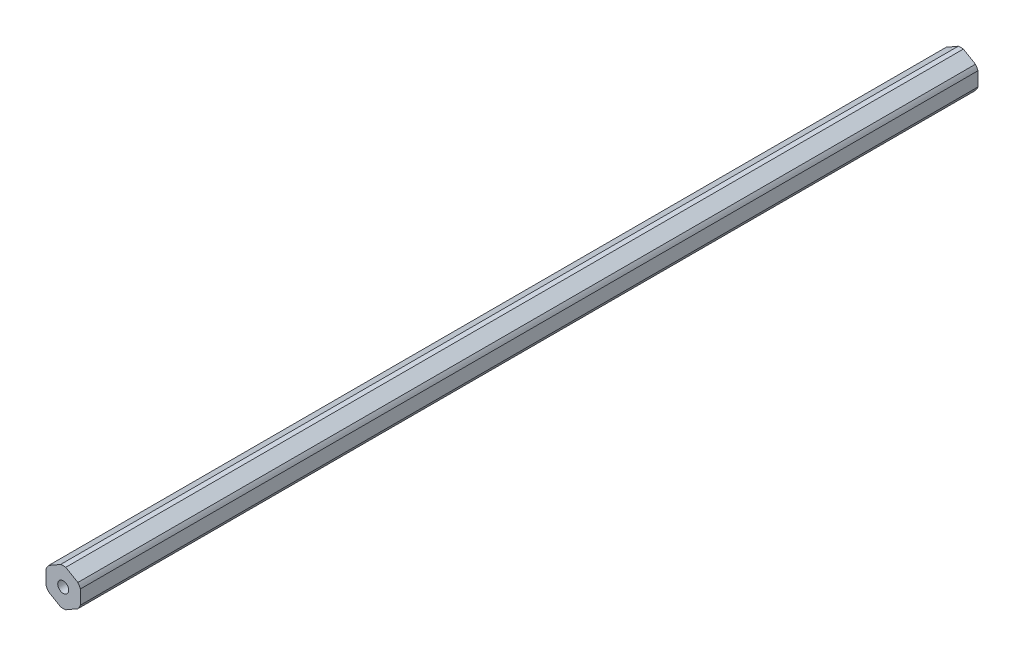
ISO-10303-21;
HEADER;
FILE_DESCRIPTION(('STEP AP214'),'2;1');
FILE_NAME('part.step','',(''),(''),'','','');
FILE_SCHEMA(('AUTOMOTIVE_DESIGN { 1 0 10303 214 1 1 1 1 }'));
ENDSEC;
DATA;
#1=APPLICATION_CONTEXT('core data for automotive mechanical design processes');
#2=APPLICATION_PROTOCOL_DEFINITION('international standard','automotive_design',2000,#1);
#3=PRODUCT_CONTEXT('',#1,'mechanical');
#4=PRODUCT('Part','Part','',(#3));
#5=PRODUCT_RELATED_PRODUCT_CATEGORY('part','',(#4));
#6=PRODUCT_DEFINITION_FORMATION('','',#4);
#7=PRODUCT_DEFINITION_CONTEXT('part definition',#1,'design');
#8=PRODUCT_DEFINITION('design','',#6,#7);
#9=PRODUCT_DEFINITION_SHAPE('','',#8);
#10=(LENGTH_UNIT() NAMED_UNIT(*) SI_UNIT(.MILLI.,.METRE.));
#11=(NAMED_UNIT(*) PLANE_ANGLE_UNIT() SI_UNIT($,.RADIAN.));
#12=(NAMED_UNIT(*) SI_UNIT($,.STERADIAN.) SOLID_ANGLE_UNIT());
#13=UNCERTAINTY_MEASURE_WITH_UNIT(LENGTH_MEASURE(1.E-05),#10,'distance_accuracy_value','');
#14=(GEOMETRIC_REPRESENTATION_CONTEXT(3) GLOBAL_UNCERTAINTY_ASSIGNED_CONTEXT((#13)) GLOBAL_UNIT_ASSIGNED_CONTEXT((#10,
#11,#12)) REPRESENTATION_CONTEXT('',''));
#15=CARTESIAN_POINT('',(0.,0.,0.));
#16=DIRECTION('',(0.,0.,1.));
#17=DIRECTION('',(1.,0.,0.));
#18=AXIS2_PLACEMENT_3D('',#15,#16,#17);
#19=CARTESIAN_POINT('',(6.35,0.,165.66388));
#20=DIRECTION('',(-1.,0.,0.));
#21=DIRECTION('',(0.,-1.,0.));
#22=AXIS2_PLACEMENT_3D('',#19,#20,#21);
#23=PLANE('',#22);
#24=DIRECTION('',(0.,1.,0.));
#25=VECTOR('',#24,1.);
#26=CARTESIAN_POINT('',(6.35,0.,-165.66388));
#27=LINE('',#26,#25);
#28=CARTESIAN_POINT('',(6.35,-2.59030191290513,-165.66388));
#29=VERTEX_POINT('',#28);
#30=CARTESIAN_POINT('',(6.35,2.59030191290513,-165.66388));
#31=VERTEX_POINT('',#30);
#32=EDGE_CURVE('E187',#29,#31,#27,.T.);
#33=ORIENTED_EDGE('',*,*,#32,.T.);
#34=DIRECTION('',(0.,0.,-1.));
#35=VECTOR('',#34,1.);
#36=CARTESIAN_POINT('',(6.35,2.59030191290513,165.66388));
#37=LINE('',#36,#35);
#38=CARTESIAN_POINT('',(6.35,2.59030191290513,165.66388));
#39=VERTEX_POINT('',#38);
#40=EDGE_CURVE('E11',#39,#31,#37,.T.);
#41=ORIENTED_EDGE('',*,*,#40,.F.);
#42=DIRECTION('',(0.,1.,0.));
#43=VECTOR('',#42,1.);
#44=CARTESIAN_POINT('',(6.35,0.,165.66388));
#45=LINE('',#44,#43);
#46=CARTESIAN_POINT('',(6.35,-2.59030191290513,165.66388));
#47=VERTEX_POINT('',#46);
#48=EDGE_CURVE('E267',#47,#39,#45,.T.);
#49=ORIENTED_EDGE('',*,*,#48,.F.);
#50=DIRECTION('',(0.,0.,-1.));
#51=VECTOR('',#50,1.);
#52=CARTESIAN_POINT('',(6.35,-2.59030191290513,165.66388));
#53=LINE('',#52,#51);
#54=EDGE_CURVE('E183',#47,#29,#53,.T.);
#55=ORIENTED_EDGE('',*,*,#54,.T.);
#56=EDGE_LOOP('',(#33,#41,#49,#55));
#57=FACE_BOUND('',#56,.T.);
#58=ADVANCED_FACE('F58',(#57),#23,.F.);
#59=CARTESIAN_POINT('',(0.,0.,165.66388));
#60=DIRECTION('',(0.,0.,-1.));
#61=DIRECTION('',(-1.,0.,0.));
#62=AXIS2_PLACEMENT_3D('',#59,#60,#61);
#63=CYLINDRICAL_SURFACE('',#62,6.858);
#64=CARTESIAN_POINT('',(0.,0.,-165.66388));
#65=DIRECTION('',(0.,0.,1.));
#66=DIRECTION('',(1.,0.,0.));
#67=AXIS2_PLACEMENT_3D('',#64,#65,#66);
#68=CIRCLE('',#67,6.858);
#69=CARTESIAN_POINT('',(5.41826726004727,4.20411035757862,-165.66388));
#70=VERTEX_POINT('',#69);
#71=EDGE_CURVE('E191',#31,#70,#68,.T.);
#72=ORIENTED_EDGE('',*,*,#71,.T.);
#73=DIRECTION('',(0.,0.,-1.));
#74=VECTOR('',#73,1.);
#75=CARTESIAN_POINT('',(5.41826726004727,4.20411035757862,165.66388));
#76=LINE('',#75,#74);
#77=CARTESIAN_POINT('',(5.41826726004727,4.20411035757862,165.66388));
#78=VERTEX_POINT('',#77);
#79=EDGE_CURVE('E67',#78,#70,#76,.T.);
#80=ORIENTED_EDGE('',*,*,#79,.F.);
#81=CARTESIAN_POINT('',(0.,0.,165.66388));
#82=DIRECTION('',(0.,0.,1.));
#83=DIRECTION('',(1.,0.,0.));
#84=AXIS2_PLACEMENT_3D('',#81,#82,#83);
#85=CIRCLE('',#84,6.858);
#86=EDGE_CURVE('E131',#39,#78,#85,.T.);
#87=ORIENTED_EDGE('',*,*,#86,.F.);
#88=ORIENTED_EDGE('',*,*,#40,.T.);
#89=EDGE_LOOP('',(#72,#80,#87,#88));
#90=FACE_BOUND('',#89,.T.);
#91=ADVANCED_FACE('F310',(#90),#63,.T.);
#92=CARTESIAN_POINT('',(3.175,5.49926131403119,165.66388));
#93=DIRECTION('',(-0.5,-0.866025403784438,0.));
#94=DIRECTION('',(0.866025403784439,-0.5,0.));
#95=AXIS2_PLACEMENT_3D('',#92,#93,#94);
#96=PLANE('',#95);
#97=DIRECTION('',(-0.866025403784439,0.5,0.));
#98=VECTOR('',#97,1.);
#99=CARTESIAN_POINT('',(3.175,5.49926131403119,-165.66388));
#100=LINE('',#99,#98);
#101=CARTESIAN_POINT('',(0.931732739952733,6.79441227048375,-165.66388));
#102=VERTEX_POINT('',#101);
#103=EDGE_CURVE('E195',#70,#102,#100,.T.);
#104=ORIENTED_EDGE('',*,*,#103,.T.);
#105=DIRECTION('',(0.,0.,-1.));
#106=VECTOR('',#105,1.);
#107=CARTESIAN_POINT('',(0.931732739952733,6.79441227048375,165.66388));
#108=LINE('',#107,#106);
#109=CARTESIAN_POINT('',(0.931732739952733,6.79441227048375,165.66388));
#110=VERTEX_POINT('',#109);
#111=EDGE_CURVE('E238',#110,#102,#108,.T.);
#112=ORIENTED_EDGE('',*,*,#111,.F.);
#113=DIRECTION('',(-0.866025403784439,0.5,0.));
#114=VECTOR('',#113,1.);
#115=CARTESIAN_POINT('',(3.175,5.49926131403119,165.66388));
#116=LINE('',#115,#114);
#117=EDGE_CURVE('E248',#78,#110,#116,.T.);
#118=ORIENTED_EDGE('',*,*,#117,.F.);
#119=ORIENTED_EDGE('',*,*,#79,.T.);
#120=EDGE_LOOP('',(#104,#112,#118,#119));
#121=FACE_BOUND('',#120,.T.);
#122=ADVANCED_FACE('F246',(#121),#96,.F.);
#123=CARTESIAN_POINT('',(-0.931732739952731,6.79441227048375,-165.66388));
#124=VERTEX_POINT('',#123);
#125=EDGE_CURVE('E196',#102,#124,#68,.T.);
#126=ORIENTED_EDGE('',*,*,#125,.T.);
#127=DIRECTION('',(0.,0.,-1.));
#128=VECTOR('',#127,1.);
#129=CARTESIAN_POINT('',(-0.931732739952731,6.79441227048375,165.66388));
#130=LINE('',#129,#128);
#131=CARTESIAN_POINT('',(-0.931732739952731,6.79441227048375,165.66388));
#132=VERTEX_POINT('',#131);
#133=EDGE_CURVE('E234',#132,#124,#130,.T.);
#134=ORIENTED_EDGE('',*,*,#133,.F.);
#135=EDGE_CURVE('E273',#110,#132,#85,.T.);
#136=ORIENTED_EDGE('',*,*,#135,.F.);
#137=ORIENTED_EDGE('',*,*,#111,.T.);
#138=EDGE_LOOP('',(#126,#134,#136,#137));
#139=FACE_BOUND('',#138,.T.);
#140=ADVANCED_FACE('F293',(#139),#63,.T.);
#141=CARTESIAN_POINT('',(-3.175,5.49926131403119,165.66388));
#142=DIRECTION('',(0.5,-0.866025403784438,0.));
#143=DIRECTION('',(0.866025403784439,0.5,0.));
#144=AXIS2_PLACEMENT_3D('',#141,#142,#143);
#145=PLANE('',#144);
#146=DIRECTION('',(-0.866025403784439,-0.5,0.));
#147=VECTOR('',#146,1.);
#148=CARTESIAN_POINT('',(-3.175,5.49926131403119,-165.66388));
#149=LINE('',#148,#147);
#150=CARTESIAN_POINT('',(-5.41826726004727,4.20411035757862,-165.66388));
#151=VERTEX_POINT('',#150);
#152=EDGE_CURVE('E199',#124,#151,#149,.T.);
#153=ORIENTED_EDGE('',*,*,#152,.T.);
#154=DIRECTION('',(0.,0.,-1.));
#155=VECTOR('',#154,1.);
#156=CARTESIAN_POINT('',(-5.41826726004727,4.20411035757862,165.66388));
#157=LINE('',#156,#155);
#158=CARTESIAN_POINT('',(-5.41826726004727,4.20411035757862,165.66388));
#159=VERTEX_POINT('',#158);
#160=EDGE_CURVE('E230',#159,#151,#157,.T.);
#161=ORIENTED_EDGE('',*,*,#160,.F.);
#162=DIRECTION('',(-0.866025403784439,-0.5,0.));
#163=VECTOR('',#162,1.);
#164=CARTESIAN_POINT('',(-3.175,5.49926131403119,165.66388));
#165=LINE('',#164,#163);
#166=EDGE_CURVE('E279',#132,#159,#165,.T.);
#167=ORIENTED_EDGE('',*,*,#166,.F.);
#168=ORIENTED_EDGE('',*,*,#133,.T.);
#169=EDGE_LOOP('',(#153,#161,#167,#168));
#170=FACE_BOUND('',#169,.T.);
#171=ADVANCED_FACE('F295',(#170),#145,.F.);
#172=CARTESIAN_POINT('',(-6.35,2.59030191290514,-165.66388));
#173=VERTEX_POINT('',#172);
#174=EDGE_CURVE('E202',#151,#173,#68,.T.);
#175=ORIENTED_EDGE('',*,*,#174,.T.);
#176=DIRECTION('',(0.,0.,-1.));
#177=VECTOR('',#176,1.);
#178=CARTESIAN_POINT('',(-6.35,2.59030191290514,165.66388));
#179=LINE('',#178,#177);
#180=CARTESIAN_POINT('',(-6.35,2.59030191290514,165.66388));
#181=VERTEX_POINT('',#180);
#182=EDGE_CURVE('E226',#181,#173,#179,.T.);
#183=ORIENTED_EDGE('',*,*,#182,.F.);
#184=EDGE_CURVE('E281',#159,#181,#85,.T.);
#185=ORIENTED_EDGE('',*,*,#184,.F.);
#186=ORIENTED_EDGE('',*,*,#160,.T.);
#187=EDGE_LOOP('',(#175,#183,#185,#186));
#188=FACE_BOUND('',#187,.T.);
#189=ADVANCED_FACE('F296',(#188),#63,.T.);
#190=CARTESIAN_POINT('',(-6.35,0.,165.66388));
#191=DIRECTION('',(1.,0.,0.));
#192=DIRECTION('',(0.,1.,0.));
#193=AXIS2_PLACEMENT_3D('',#190,#191,#192);
#194=PLANE('',#193);
#195=DIRECTION('',(0.,-1.,0.));
#196=VECTOR('',#195,1.);
#197=CARTESIAN_POINT('',(-6.35,0.,-165.66388));
#198=LINE('',#197,#196);
#199=CARTESIAN_POINT('',(-6.35,-2.59030191290514,-165.66388));
#200=VERTEX_POINT('',#199);
#201=EDGE_CURVE('E203',#173,#200,#198,.T.);
#202=ORIENTED_EDGE('',*,*,#201,.T.);
#203=DIRECTION('',(0.,0.,-1.));
#204=VECTOR('',#203,1.);
#205=CARTESIAN_POINT('',(-6.35,-2.59030191290514,165.66388));
#206=LINE('',#205,#204);
#207=CARTESIAN_POINT('',(-6.35,-2.59030191290514,165.66388));
#208=VERTEX_POINT('',#207);
#209=EDGE_CURVE('E222',#208,#200,#206,.T.);
#210=ORIENTED_EDGE('',*,*,#209,.F.);
#211=DIRECTION('',(0.,-1.,0.));
#212=VECTOR('',#211,1.);
#213=CARTESIAN_POINT('',(-6.35,0.,165.66388));
#214=LINE('',#213,#212);
#215=EDGE_CURVE('E282',#181,#208,#214,.T.);
#216=ORIENTED_EDGE('',*,*,#215,.F.);
#217=ORIENTED_EDGE('',*,*,#182,.T.);
#218=EDGE_LOOP('',(#202,#210,#216,#217));
#219=FACE_BOUND('',#218,.T.);
#220=ADVANCED_FACE('F299',(#219),#194,.F.);
#221=CARTESIAN_POINT('',(-5.41826726004728,-4.20411035757862,-165.66388));
#222=VERTEX_POINT('',#221);
#223=EDGE_CURVE('E206',#200,#222,#68,.T.);
#224=ORIENTED_EDGE('',*,*,#223,.T.);
#225=DIRECTION('',(0.,0.,-1.));
#226=VECTOR('',#225,1.);
#227=CARTESIAN_POINT('',(-5.41826726004728,-4.20411035757862,165.66388));
#228=LINE('',#227,#226);
#229=CARTESIAN_POINT('',(-5.41826726004728,-4.20411035757862,165.66388));
#230=VERTEX_POINT('',#229);
#231=EDGE_CURVE('E218',#230,#222,#228,.T.);
#232=ORIENTED_EDGE('',*,*,#231,.F.);
#233=EDGE_CURVE('E170',#208,#230,#85,.T.);
#234=ORIENTED_EDGE('',*,*,#233,.F.);
#235=ORIENTED_EDGE('',*,*,#209,.T.);
#236=EDGE_LOOP('',(#224,#232,#234,#235));
#237=FACE_BOUND('',#236,.T.);
#238=ADVANCED_FACE('F301',(#237),#63,.T.);
#239=CARTESIAN_POINT('',(-3.175,-5.49926131403118,165.66388));
#240=DIRECTION('',(0.5,0.866025403784439,0.));
#241=DIRECTION('',(-0.866025403784439,0.5,0.));
#242=AXIS2_PLACEMENT_3D('',#239,#240,#241);
#243=PLANE('',#242);
#244=DIRECTION('',(0.866025403784439,-0.5,0.));
#245=VECTOR('',#244,1.);
#246=CARTESIAN_POINT('',(-3.175,-5.49926131403118,-165.66388));
#247=LINE('',#246,#245);
#248=CARTESIAN_POINT('',(-0.931732739952721,-6.79441227048375,-165.66388));
#249=VERTEX_POINT('',#248);
#250=EDGE_CURVE('E207',#222,#249,#247,.T.);
#251=ORIENTED_EDGE('',*,*,#250,.T.);
#252=DIRECTION('',(0.,0.,-1.));
#253=VECTOR('',#252,1.);
#254=CARTESIAN_POINT('',(-0.931732739952721,-6.79441227048375,165.66388));
#255=LINE('',#254,#253);
#256=CARTESIAN_POINT('',(-0.931732739952721,-6.79441227048375,165.66388));
#257=VERTEX_POINT('',#256);
#258=EDGE_CURVE('E176',#257,#249,#255,.T.);
#259=ORIENTED_EDGE('',*,*,#258,.F.);
#260=DIRECTION('',(0.866025403784439,-0.5,0.));
#261=VECTOR('',#260,1.);
#262=CARTESIAN_POINT('',(-3.175,-5.49926131403118,165.66388));
#263=LINE('',#262,#261);
#264=EDGE_CURVE('E164',#230,#257,#263,.T.);
#265=ORIENTED_EDGE('',*,*,#264,.F.);
#266=ORIENTED_EDGE('',*,*,#231,.T.);
#267=EDGE_LOOP('',(#251,#259,#265,#266));
#268=FACE_BOUND('',#267,.T.);
#269=ADVANCED_FACE('F304',(#268),#243,.F.);
#270=CARTESIAN_POINT('',(0.931732739952731,-6.79441227048375,-165.66388));
#271=VERTEX_POINT('',#270);
#272=EDGE_CURVE('E174',#249,#271,#68,.T.);
#273=ORIENTED_EDGE('',*,*,#272,.T.);
#274=DIRECTION('',(0.,0.,-1.));
#275=VECTOR('',#274,1.);
#276=CARTESIAN_POINT('',(0.931732739952731,-6.79441227048375,165.66388));
#277=LINE('',#276,#275);
#278=CARTESIAN_POINT('',(0.931732739952731,-6.79441227048375,165.66388));
#279=VERTEX_POINT('',#278);
#280=EDGE_CURVE('E171',#279,#271,#277,.T.);
#281=ORIENTED_EDGE('',*,*,#280,.F.);
#282=EDGE_CURVE('E158',#257,#279,#85,.T.);
#283=ORIENTED_EDGE('',*,*,#282,.F.);
#284=ORIENTED_EDGE('',*,*,#258,.T.);
#285=EDGE_LOOP('',(#273,#281,#283,#284));
#286=FACE_BOUND('',#285,.T.);
#287=ADVANCED_FACE('F172',(#286),#63,.T.);
#288=CARTESIAN_POINT('',(3.175,-5.49926131403118,165.66388));
#289=DIRECTION('',(-0.5,0.866025403784438,0.));
#290=DIRECTION('',(-0.866025403784439,-0.5,0.));
#291=AXIS2_PLACEMENT_3D('',#288,#289,#290);
#292=PLANE('',#291);
#293=DIRECTION('',(0.866025403784439,0.5,0.));
#294=VECTOR('',#293,1.);
#295=CARTESIAN_POINT('',(3.175,-5.49926131403118,-165.66388));
#296=LINE('',#295,#294);
#297=CARTESIAN_POINT('',(5.41826726004727,-4.20411035757862,-165.66388));
#298=VERTEX_POINT('',#297);
#299=EDGE_CURVE('E117',#271,#298,#296,.T.);
#300=ORIENTED_EDGE('',*,*,#299,.T.);
#301=DIRECTION('',(0.,0.,-1.));
#302=VECTOR('',#301,1.);
#303=CARTESIAN_POINT('',(5.41826726004727,-4.20411035757862,165.66388));
#304=LINE('',#303,#302);
#305=CARTESIAN_POINT('',(5.41826726004727,-4.20411035757862,165.66388));
#306=VERTEX_POINT('',#305);
#307=EDGE_CURVE('E177',#306,#298,#304,.T.);
#308=ORIENTED_EDGE('',*,*,#307,.F.);
#309=DIRECTION('',(0.866025403784439,0.5,0.));
#310=VECTOR('',#309,1.);
#311=CARTESIAN_POINT('',(3.175,-5.49926131403118,165.66388));
#312=LINE('',#311,#310);
#313=EDGE_CURVE('E162',#279,#306,#312,.T.);
#314=ORIENTED_EDGE('',*,*,#313,.F.);
#315=ORIENTED_EDGE('',*,*,#280,.T.);
#316=EDGE_LOOP('',(#300,#308,#314,#315));
#317=FACE_BOUND('',#316,.T.);
#318=ADVANCED_FACE('F179',(#317),#292,.F.);
#319=EDGE_CURVE('E123',#298,#29,#68,.T.);
#320=ORIENTED_EDGE('',*,*,#319,.T.);
#321=ORIENTED_EDGE('',*,*,#54,.F.);
#322=EDGE_CURVE('E75',#306,#47,#85,.T.);
#323=ORIENTED_EDGE('',*,*,#322,.F.);
#324=ORIENTED_EDGE('',*,*,#307,.T.);
#325=EDGE_LOOP('',(#320,#321,#323,#324));
#326=FACE_BOUND('',#325,.T.);
#327=ADVANCED_FACE('F307',(#326),#63,.T.);
#328=CARTESIAN_POINT('',(0.,0.,165.66388));
#329=DIRECTION('',(0.,0.,1.));
#330=DIRECTION('',(1.,0.,0.));
#331=AXIS2_PLACEMENT_3D('',#328,#329,#330);
#332=PLANE('',#331);
#333=CARTESIAN_POINT('',(0.,0.,165.66388));
#334=DIRECTION('',(0.,0.,1.));
#335=DIRECTION('',(1.,0.,0.));
#336=AXIS2_PLACEMENT_3D('',#333,#334,#335);
#337=CIRCLE('',#336,2.01929999999999);
#338=CARTESIAN_POINT('',(2.01929999999999,0.,165.66388));
#339=VERTEX_POINT('',#338);
#340=EDGE_CURVE('E476',#339,#339,#337,.T.);
#341=ORIENTED_EDGE('',*,*,#340,.F.);
#342=EDGE_LOOP('',(#341));
#343=FACE_BOUND('',#342,.T.);
#344=ORIENTED_EDGE('',*,*,#48,.T.);
#345=ORIENTED_EDGE('',*,*,#86,.T.);
#346=ORIENTED_EDGE('',*,*,#117,.T.);
#347=ORIENTED_EDGE('',*,*,#135,.T.);
#348=ORIENTED_EDGE('',*,*,#166,.T.);
#349=ORIENTED_EDGE('',*,*,#184,.T.);
#350=ORIENTED_EDGE('',*,*,#215,.T.);
#351=ORIENTED_EDGE('',*,*,#233,.T.);
#352=ORIENTED_EDGE('',*,*,#264,.T.);
#353=ORIENTED_EDGE('',*,*,#282,.T.);
#354=ORIENTED_EDGE('',*,*,#313,.T.);
#355=ORIENTED_EDGE('',*,*,#322,.T.);
#356=EDGE_LOOP('',(#344,#345,#346,#347,#348,#349,#350,#351,#352,#353,#354,#355));
#357=FACE_BOUND('',#356,.T.);
#358=ADVANCED_FACE('F160',(#343,#357),#332,.T.);
#359=CARTESIAN_POINT('',(0.,0.,-165.66388));
#360=DIRECTION('',(0.,0.,1.));
#361=DIRECTION('',(1.,0.,0.));
#362=AXIS2_PLACEMENT_3D('',#359,#360,#361);
#363=PLANE('',#362);
#364=CARTESIAN_POINT('',(0.,0.,-165.66388));
#365=DIRECTION('',(0.,0.,-1.));
#366=DIRECTION('',(-1.,0.,0.));
#367=AXIS2_PLACEMENT_3D('',#364,#365,#366);
#368=CIRCLE('',#367,2.01929999999999);
#369=CARTESIAN_POINT('',(-2.01929999999999,0.,-165.66388));
#370=VERTEX_POINT('',#369);
#371=EDGE_CURVE('E480',#370,#370,#368,.T.);
#372=ORIENTED_EDGE('',*,*,#371,.F.);
#373=EDGE_LOOP('',(#372));
#374=FACE_BOUND('',#373,.T.);
#375=ORIENTED_EDGE('',*,*,#32,.F.);
#376=ORIENTED_EDGE('',*,*,#319,.F.);
#377=ORIENTED_EDGE('',*,*,#299,.F.);
#378=ORIENTED_EDGE('',*,*,#272,.F.);
#379=ORIENTED_EDGE('',*,*,#250,.F.);
#380=ORIENTED_EDGE('',*,*,#223,.F.);
#381=ORIENTED_EDGE('',*,*,#201,.F.);
#382=ORIENTED_EDGE('',*,*,#174,.F.);
#383=ORIENTED_EDGE('',*,*,#152,.F.);
#384=ORIENTED_EDGE('',*,*,#125,.F.);
#385=ORIENTED_EDGE('',*,*,#103,.F.);
#386=ORIENTED_EDGE('',*,*,#71,.F.);
#387=EDGE_LOOP('',(#375,#376,#377,#378,#379,#380,#381,#382,#383,#384,#385,#386));
#388=FACE_BOUND('',#387,.T.);
#389=ADVANCED_FACE('F252',(#374,#388),#363,.F.);
#390=CARTESIAN_POINT('',(0.,0.,-149.31644));
#391=DIRECTION('',(0.,0.,-1.));
#392=DIRECTION('',(-1.,0.,0.));
#393=AXIS2_PLACEMENT_3D('',#390,#391,#392);
#394=CONICAL_SURFACE('',#393,2.01929999999999,1.02974425867665);
#395=CARTESIAN_POINT('',(0.,0.,-148.103122151998));
#396=VERTEX_POINT('',#395);
#397=VERTEX_LOOP('',#396);
#398=FACE_BOUND('',#397,.T.);
#399=CARTESIAN_POINT('',(0.,0.,-149.31644));
#400=DIRECTION('',(0.,0.,-1.));
#401=DIRECTION('',(-1.,0.,0.));
#402=AXIS2_PLACEMENT_3D('',#399,#400,#401);
#403=CIRCLE('',#402,2.01929999999999);
#404=CARTESIAN_POINT('',(-2.01929999999999,0.,-149.31644));
#405=VERTEX_POINT('',#404);
#406=EDGE_CURVE('E192',#405,#405,#403,.T.);
#407=ORIENTED_EDGE('',*,*,#406,.T.);
#408=EDGE_LOOP('',(#407));
#409=FACE_BOUND('',#408,.T.);
#410=ADVANCED_FACE('F406',(#398,#409),#394,.F.);
#411=CARTESIAN_POINT('',(0.,0.,-165.66388));
#412=DIRECTION('',(0.,0.,-1.));
#413=DIRECTION('',(-1.,0.,0.));
#414=AXIS2_PLACEMENT_3D('',#411,#412,#413);
#415=CYLINDRICAL_SURFACE('',#414,2.01929999999999);
#416=ORIENTED_EDGE('',*,*,#406,.F.);
#417=EDGE_LOOP('',(#416));
#418=FACE_BOUND('',#417,.T.);
#419=ORIENTED_EDGE('',*,*,#371,.T.);
#420=EDGE_LOOP('',(#419));
#421=FACE_BOUND('',#420,.T.);
#422=ADVANCED_FACE('F415',(#418,#421),#415,.F.);
#423=CARTESIAN_POINT('',(0.,0.,149.31644));
#424=DIRECTION('',(0.,0.,1.));
#425=DIRECTION('',(1.,0.,0.));
#426=AXIS2_PLACEMENT_3D('',#423,#424,#425);
#427=CONICAL_SURFACE('',#426,2.01929999999999,1.02974425867665);
#428=CARTESIAN_POINT('',(0.,0.,148.103122151998));
#429=VERTEX_POINT('',#428);
#430=VERTEX_LOOP('',#429);
#431=FACE_BOUND('',#430,.T.);
#432=CARTESIAN_POINT('',(0.,0.,149.31644));
#433=DIRECTION('',(0.,0.,1.));
#434=DIRECTION('',(1.,0.,0.));
#435=AXIS2_PLACEMENT_3D('',#432,#433,#434);
#436=CIRCLE('',#435,2.01929999999999);
#437=CARTESIAN_POINT('',(2.01929999999999,0.,149.31644));
#438=VERTEX_POINT('',#437);
#439=EDGE_CURVE('E473',#438,#438,#436,.T.);
#440=ORIENTED_EDGE('',*,*,#439,.T.);
#441=EDGE_LOOP('',(#440));
#442=FACE_BOUND('',#441,.T.);
#443=ADVANCED_FACE('F426',(#431,#442),#427,.F.);
#444=CARTESIAN_POINT('',(0.,0.,165.66388));
#445=DIRECTION('',(0.,0.,1.));
#446=DIRECTION('',(1.,0.,0.));
#447=AXIS2_PLACEMENT_3D('',#444,#445,#446);
#448=CYLINDRICAL_SURFACE('',#447,2.01929999999999);
#449=ORIENTED_EDGE('',*,*,#439,.F.);
#450=EDGE_LOOP('',(#449));
#451=FACE_BOUND('',#450,.T.);
#452=ORIENTED_EDGE('',*,*,#340,.T.);
#453=EDGE_LOOP('',(#452));
#454=FACE_BOUND('',#453,.T.);
#455=ADVANCED_FACE('F437',(#451,#454),#448,.F.);
#456=CLOSED_SHELL('',(#58,#91,#122,#140,#171,#189,#220,#238,#269,#287,#318,#327,#358,#389,#410,
#422,#443,#455));
#457=MANIFOLD_SOLID_BREP('B2',#456);
#458=ADVANCED_BREP_SHAPE_REPRESENTATION('',(#18,#457),#14);
#459=SHAPE_DEFINITION_REPRESENTATION(#9,#458);
ENDSEC;
END-ISO-10303-21;
